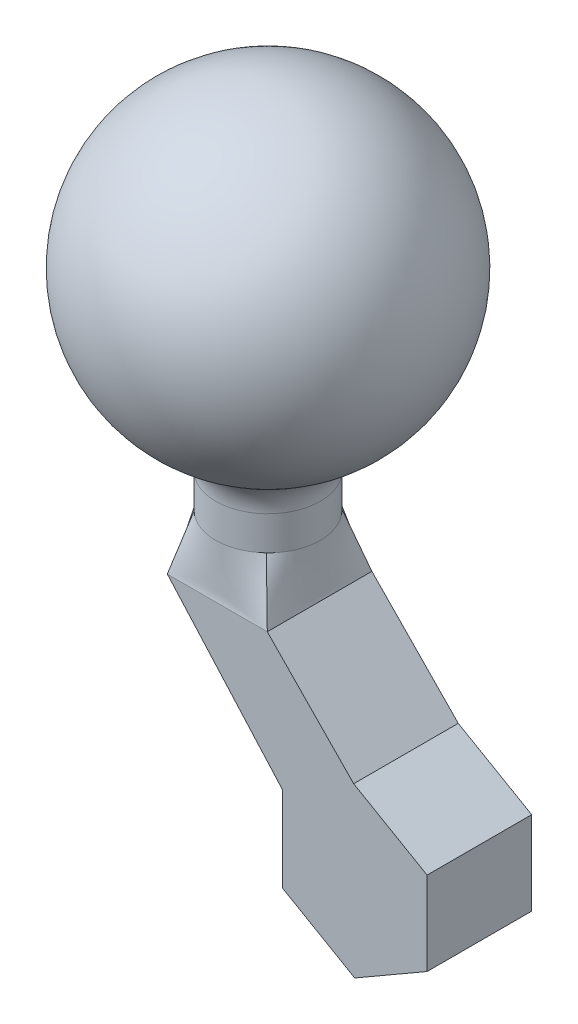
ISO-10303-21;
HEADER;
FILE_DESCRIPTION(('STEP AP214'),'2;1');
FILE_NAME('part.step','',(''),(''),'','','');
FILE_SCHEMA(('AUTOMOTIVE_DESIGN { 1 0 10303 214 1 1 1 1 }'));
ENDSEC;
DATA;
#1=APPLICATION_CONTEXT('core data for automotive mechanical design processes');
#2=APPLICATION_PROTOCOL_DEFINITION('international standard','automotive_design',2000,#1);
#3=PRODUCT_CONTEXT('',#1,'mechanical');
#4=PRODUCT('Part','Part','',(#3));
#5=PRODUCT_RELATED_PRODUCT_CATEGORY('part','',(#4));
#6=PRODUCT_DEFINITION_FORMATION('','',#4);
#7=PRODUCT_DEFINITION_CONTEXT('part definition',#1,'design');
#8=PRODUCT_DEFINITION('design','',#6,#7);
#9=PRODUCT_DEFINITION_SHAPE('','',#8);
#10=(LENGTH_UNIT() NAMED_UNIT(*) SI_UNIT(.MILLI.,.METRE.));
#11=(NAMED_UNIT(*) PLANE_ANGLE_UNIT() SI_UNIT($,.RADIAN.));
#12=(NAMED_UNIT(*) SI_UNIT($,.STERADIAN.) SOLID_ANGLE_UNIT());
#13=UNCERTAINTY_MEASURE_WITH_UNIT(LENGTH_MEASURE(1.E-05),#10,'distance_accuracy_value','');
#14=(GEOMETRIC_REPRESENTATION_CONTEXT(3) GLOBAL_UNCERTAINTY_ASSIGNED_CONTEXT((#13)) GLOBAL_UNIT_ASSIGNED_CONTEXT((#10,
#11,#12)) REPRESENTATION_CONTEXT('',''));
#15=CARTESIAN_POINT('',(0.,0.,0.));
#16=DIRECTION('',(0.,0.,1.));
#17=DIRECTION('',(1.,0.,0.));
#18=AXIS2_PLACEMENT_3D('',#15,#16,#17);
#19=CARTESIAN_POINT('',(0.,0.,0.));
#20=DIRECTION('',(0.,1.,0.));
#21=DIRECTION('',(-1.,0.,0.));
#22=AXIS2_PLACEMENT_3D('',#19,#20,#21);
#23=SPHERICAL_SURFACE('',#22,18.);
#24=CARTESIAN_POINT('',(0.,-15.8079207730885,0.));
#25=DIRECTION('',(0.,1.,0.));
#26=DIRECTION('',(0.,0.,1.));
#27=AXIS2_PLACEMENT_3D('',#24,#25,#26);
#28=CIRCLE('',#27,8.60869565217391);
#29=CARTESIAN_POINT('',(0.,-15.8079207730885,8.60869565217391));
#30=VERTEX_POINT('',#29);
#31=EDGE_CURVE('E71',#30,#30,#28,.T.);
#32=ORIENTED_EDGE('',*,*,#31,.T.);
#33=EDGE_LOOP('',(#32));
#34=FACE_BOUND('',#33,.T.);
#35=ADVANCED_FACE('F63',(#34),#23,.T.);
#36=CARTESIAN_POINT('',(0.,18.,0.));
#37=DIRECTION('',(0.,1.,0.));
#38=DIRECTION('',(0.,0.,1.));
#39=AXIS2_PLACEMENT_3D('',#36,#37,#38);
#40=CYLINDRICAL_SURFACE('',#39,6.);
#41=CARTESIAN_POINT('',(0.,-20.1990098767242,0.));
#42=DIRECTION('',(0.,1.,0.));
#43=DIRECTION('',(0.,0.,1.));
#44=AXIS2_PLACEMENT_3D('',#41,#42,#43);
#45=CIRCLE('',#44,6.);
#46=CARTESIAN_POINT('',(0.,-20.1990098767242,6.));
#47=VERTEX_POINT('',#46);
#48=EDGE_CURVE('E12',#47,#47,#45,.F.);
#49=ORIENTED_EDGE('',*,*,#48,.T.);
#50=EDGE_LOOP('',(#49));
#51=FACE_BOUND('',#50,.T.);
#52=CARTESIAN_POINT('',(4.14571833013754,-24.08,-4.33739778290643));
#53=CARTESIAN_POINT('',(4.40701026801478,-24.08,-4.08765292882736));
#54=CARTESIAN_POINT('',(4.65592378793548,-24.08,-3.80429383977832));
#55=CARTESIAN_POINT('',(5.10675760325183,-24.08,-3.17353189996074));
#56=CARTESIAN_POINT('',(5.30852063268487,-24.08,-2.82608401074052));
#57=CARTESIAN_POINT('',(5.64280491949333,-24.08,-2.07987855028752));
#58=CARTESIAN_POINT('',(5.77514435532255,-24.08,-1.68118045171521));
#59=CARTESIAN_POINT('',(5.95380439136581,-24.08,-0.854911285102975));
#60=CARTESIAN_POINT('',(6.,-24.08,-0.42751017146044));
#61=CARTESIAN_POINT('',(6.,-24.08,0.42751017146044));
#62=CARTESIAN_POINT('',(5.95380439136581,-24.08,0.854911285102975));
#63=CARTESIAN_POINT('',(5.77514435532255,-24.08,1.68118045171521));
#64=CARTESIAN_POINT('',(5.64280491949333,-24.08,2.07987855028752));
#65=CARTESIAN_POINT('',(5.30852063268487,-24.08,2.82608401074052));
#66=CARTESIAN_POINT('',(5.10675760325182,-24.08,3.17353189996074));
#67=CARTESIAN_POINT('',(4.65592378793549,-24.08,3.80429383977832));
#68=CARTESIAN_POINT('',(4.40701026801478,-24.08,4.08765292882735));
#69=CARTESIAN_POINT('',(4.14571833013754,-24.08,4.33739778290643));
#70=B_SPLINE_CURVE_WITH_KNOTS('',3,(#52,#53,#54,#55,#56,#57,#58,#59,#60,#61,#62,#63,#64,#65,#66,
#67,#68,#69),.UNSPECIFIED.,.F.,.F.,(4,2,2,2,2,2,2,2,4),(0.,0.125,0.25,0.375,0.5,0.625,0.75,
0.875,1.),.UNSPECIFIED.);
#71=CARTESIAN_POINT('',(4.14574127214119,-24.08,4.33742170811708));
#72=VERTEX_POINT('',#71);
#73=CARTESIAN_POINT('',(4.1457314055669,-24.08,-4.33741142811178));
#74=VERTEX_POINT('',#73);
#75=EDGE_CURVE('E235',#72,#74,#70,.F.);
#76=ORIENTED_EDGE('',*,*,#75,.T.);
#77=CARTESIAN_POINT('',(0.,-24.08,0.));
#78=DIRECTION('',(0.,1.,0.));
#79=DIRECTION('',(0.,0.,1.));
#80=AXIS2_PLACEMENT_3D('',#77,#78,#79);
#81=CIRCLE('',#80,6.);
#82=CARTESIAN_POINT('',(-4.14574127213373,-24.08,-4.33742170810931));
#83=VERTEX_POINT('',#82);
#84=EDGE_CURVE('E244',#74,#83,#81,.T.);
#85=ORIENTED_EDGE('',*,*,#84,.T.);
#86=CARTESIAN_POINT('',(-4.14573140556426,-24.08,4.33741142810902));
#87=VERTEX_POINT('',#86);
#88=EDGE_CURVE('E78',#83,#87,#81,.T.);
#89=ORIENTED_EDGE('',*,*,#88,.T.);
#90=EDGE_CURVE('E87',#87,#72,#81,.T.);
#91=ORIENTED_EDGE('',*,*,#90,.T.);
#92=EDGE_LOOP('',(#76,#85,#89,#91));
#93=FACE_BOUND('',#92,.T.);
#94=ADVANCED_FACE('F255',(#51,#93),#40,.T.);
#95=CARTESIAN_POINT('',(-5.55391904442774,-30.2,6.));
#96=CARTESIAN_POINT('',(-4.14571833013754,-24.08,4.33739778290643));
#97=CARTESIAN_POINT('',(-4.59811131416244,-30.2,6.));
#98=CARTESIAN_POINT('',(-3.6462286219794,-24.08,4.81481390715194));
#99=CARTESIAN_POINT('',(-3.64230358389714,-30.2,6.));
#100=CARTESIAN_POINT('',(-3.0247003274216,-24.08,5.23886904541464));
#101=CARTESIAN_POINT('',(-2.20859198849919,-30.2,6.));
#102=CARTESIAN_POINT('',(-1.95749985474671,-24.08,5.68478975469574));
#103=CARTESIAN_POINT('',(-1.73068812336654,-30.2,6.));
#104=CARTESIAN_POINT('',(-1.58029554790363,-24.08,5.80175097549326));
#105=CARTESIAN_POINT('',(-0.774880393101239,-30.2,6.));
#106=CARTESIAN_POINT('',(-0.802002169216812,-24.08,5.95939937585429));
#107=CARTESIAN_POINT('',(-0.296976527968589,-30.2,6.));
#108=CARTESIAN_POINT('',(-0.401040805162086,-24.08,6.));
#109=CARTESIAN_POINT('',(0.658831202296711,-30.2,6.));
#110=CARTESIAN_POINT('',(0.401040805162083,-24.08,6.));
#111=CARTESIAN_POINT('',(1.13673506742936,-30.2,6.));
#112=CARTESIAN_POINT('',(0.802002169216809,-24.08,5.95939937585429));
#113=CARTESIAN_POINT('',(2.09254279769466,-30.2,6.));
#114=CARTESIAN_POINT('',(1.58029554790363,-24.08,5.80175097549326));
#115=CARTESIAN_POINT('',(2.57044666282731,-30.2,6.));
#116=CARTESIAN_POINT('',(1.9574998547467,-24.08,5.68478975469574));
#117=CARTESIAN_POINT('',(4.00415825822526,-30.2,6.));
#118=CARTESIAN_POINT('',(3.0247003274216,-24.08,5.23886904541465));
#119=CARTESIAN_POINT('',(4.95996598849056,-30.2,6.));
#120=CARTESIAN_POINT('',(3.6462286219794,-24.08,4.81481390715194));
#121=CARTESIAN_POINT('',(5.91577371875587,-30.2,6.));
#122=CARTESIAN_POINT('',(4.14571833013754,-24.08,4.33739778290643));
#123=B_SPLINE_SURFACE_WITH_KNOTS('',3,1,((#95,#96),(#97,#98),(#99,#100),(#101,#102),(#103,#104),
(#105,#106),(#107,#108),(#109,#110),(#111,#112),(#113,#114),(#115,#116),(#117,#118),(#119,#120),
(#121,#122)),.UNSPECIFIED.,.F.,.F.,.F.,(4,2,2,2,2,2,4),(2,2),(0.,0.25,0.375,0.5,0.625,0.75,1.),
(0.,1.),.UNSPECIFIED.);
#124=DIRECTION('',(-1.,0.,0.));
#125=VECTOR('',#124,1.);
#126=CARTESIAN_POINT('',(-5.55391904442774,-30.2,6.));
#127=LINE('',#126,#125);
#128=CARTESIAN_POINT('',(5.91577371875587,-30.2,6.));
#129=VERTEX_POINT('',#128);
#130=CARTESIAN_POINT('',(-5.55391904442774,-30.2,6.));
#131=VERTEX_POINT('',#130);
#132=EDGE_CURVE('E144',#129,#131,#127,.T.);
#133=DIRECTION('',(-0.268833619175831,0.929497325301414,-0.252513776769391));
#134=VECTOR('',#133,1.);
#135=CARTESIAN_POINT('',(5.0307460244467,-27.14,5.16869889145321));
#136=LINE('',#135,#134);
#137=EDGE_CURVE('E147',#129,#72,#136,.T.);
#138=DIRECTION('',(-0.216770267725418,-0.942077379323195,0.255931362669354));
#139=VECTOR('',#138,1.);
#140=CARTESIAN_POINT('',(-4.84981868728264,-27.14,5.16869889145321));
#141=LINE('',#140,#139);
#142=EDGE_CURVE('E140',#87,#131,#141,.T.);
#143=ORIENTED_EDGE('',*,*,#132,.F.);
#144=ORIENTED_EDGE('',*,*,#137,.T.);
#145=ORIENTED_EDGE('',*,*,#90,.F.);
#146=ORIENTED_EDGE('',*,*,#142,.T.);
#147=EDGE_LOOP('',(#143,#144,#145,#146));
#148=FACE_BOUND('',#147,.T.);
#149=ADVANCED_FACE('F142',(#148),#123,.T.);
#150=CARTESIAN_POINT('',(5.91577371875587,-30.2,6.));
#151=CARTESIAN_POINT('',(4.14571833013754,-24.08,4.33739778290643));
#152=CARTESIAN_POINT('',(5.91577371875587,-30.2,5.5));
#153=CARTESIAN_POINT('',(4.40701026801478,-24.08,4.08765292882735));
#154=CARTESIAN_POINT('',(5.91577371875587,-30.2,5.));
#155=CARTESIAN_POINT('',(4.65592378793549,-24.08,3.80429383977832));
#156=CARTESIAN_POINT('',(5.91577371875587,-30.2,4.));
#157=CARTESIAN_POINT('',(5.10675760325182,-24.08,3.17353189996074));
#158=CARTESIAN_POINT('',(5.91577371875587,-30.2,3.5));
#159=CARTESIAN_POINT('',(5.30852063268487,-24.08,2.82608401074052));
#160=CARTESIAN_POINT('',(5.91577371875587,-30.2,2.5));
#161=CARTESIAN_POINT('',(5.64280491949333,-24.08,2.07987855028752));
#162=CARTESIAN_POINT('',(5.91577371875587,-30.2,2.));
#163=CARTESIAN_POINT('',(5.77514435532255,-24.08,1.68118045171521));
#164=CARTESIAN_POINT('',(5.91577371875587,-30.2,0.999999999999999));
#165=CARTESIAN_POINT('',(5.95380439136581,-24.08,0.854911285102975));
#166=CARTESIAN_POINT('',(5.91577371875587,-30.2,0.499999999999999));
#167=CARTESIAN_POINT('',(6.,-24.08,0.42751017146044));
#168=CARTESIAN_POINT('',(5.91577371875587,-30.2,-0.500000000000001));
#169=CARTESIAN_POINT('',(6.,-24.08,-0.42751017146044));
#170=CARTESIAN_POINT('',(5.91577371875587,-30.2,-1.));
#171=CARTESIAN_POINT('',(5.95380439136581,-24.08,-0.854911285102975));
#172=CARTESIAN_POINT('',(5.91577371875587,-30.2,-2.));
#173=CARTESIAN_POINT('',(5.77514435532255,-24.08,-1.68118045171521));
#174=CARTESIAN_POINT('',(5.91577371875587,-30.2,-2.5));
#175=CARTESIAN_POINT('',(5.64280491949333,-24.08,-2.07987855028752));
#176=CARTESIAN_POINT('',(5.91577371875587,-30.2,-3.5));
#177=CARTESIAN_POINT('',(5.30852063268487,-24.08,-2.82608401074052));
#178=CARTESIAN_POINT('',(5.91577371875587,-30.2,-4.));
#179=CARTESIAN_POINT('',(5.10675760325183,-24.08,-3.17353189996074));
#180=CARTESIAN_POINT('',(5.91577371875587,-30.2,-5.));
#181=CARTESIAN_POINT('',(4.65592378793548,-24.08,-3.80429383977832));
#182=CARTESIAN_POINT('',(5.91577371875587,-30.2,-5.5));
#183=CARTESIAN_POINT('',(4.40701026801478,-24.08,-4.08765292882736));
#184=CARTESIAN_POINT('',(5.91577371875587,-30.2,-6.));
#185=CARTESIAN_POINT('',(4.14571833013754,-24.08,-4.33739778290643));
#186=B_SPLINE_SURFACE_WITH_KNOTS('',3,1,((#150,#151),(#152,#153),(#154,#155),(#156,#157),(#158,
#159),(#160,#161),(#162,#163),(#164,#165),(#166,#167),(#168,#169),(#170,#171),(#172,#173),(#174,
#175),(#176,#177),(#178,#179),(#180,#181),(#182,#183),(#184,#185)),.UNSPECIFIED.,.F.,.F.,.F.,(4,
2,2,2,2,2,2,2,4),(2,2),(0.,0.125,0.25,0.375,0.5,0.625,0.75,0.875,1.),(0.,1.),.UNSPECIFIED.);
#187=DIRECTION('',(0.,0.,1.));
#188=VECTOR('',#187,1.);
#189=CARTESIAN_POINT('',(5.91577371875587,-30.2,-6.));
#190=LINE('',#189,#188);
#191=CARTESIAN_POINT('',(5.91577371875587,-30.2,-6.));
#192=VERTEX_POINT('',#191);
#193=EDGE_CURVE('E180',#192,#129,#190,.T.);
#194=DIRECTION('',(-0.268833619175832,0.929497325301414,0.252513776769391));
#195=VECTOR('',#194,1.);
#196=CARTESIAN_POINT('',(5.0307460244467,-27.14,-5.16869889145321));
#197=LINE('',#196,#195);
#198=EDGE_CURVE('E465',#192,#74,#197,.T.);
#199=ORIENTED_EDGE('',*,*,#193,.F.);
#200=ORIENTED_EDGE('',*,*,#198,.T.);
#201=ORIENTED_EDGE('',*,*,#75,.F.);
#202=ORIENTED_EDGE('',*,*,#137,.F.);
#203=EDGE_LOOP('',(#199,#200,#201,#202));
#204=FACE_BOUND('',#203,.T.);
#205=ADVANCED_FACE('F285',(#204),#186,.T.);
#206=CARTESIAN_POINT('',(-5.55391904442774,-30.2,-6.));
#207=CARTESIAN_POINT('',(-4.14571833013754,-24.08,-4.33739778290643));
#208=CARTESIAN_POINT('',(-5.55391904442774,-30.2,-5.5));
#209=CARTESIAN_POINT('',(-4.40701026801478,-24.08,-4.08765292882736));
#210=CARTESIAN_POINT('',(-5.55391904442774,-30.2,-5.));
#211=CARTESIAN_POINT('',(-4.65592378793548,-24.08,-3.80429383977832));
#212=CARTESIAN_POINT('',(-5.55391904442774,-30.2,-4.));
#213=CARTESIAN_POINT('',(-5.10675760325182,-24.08,-3.17353189996074));
#214=CARTESIAN_POINT('',(-5.55391904442774,-30.2,-3.5));
#215=CARTESIAN_POINT('',(-5.30852063268487,-24.08,-2.82608401074052));
#216=CARTESIAN_POINT('',(-5.55391904442774,-30.2,-2.50000000000001));
#217=CARTESIAN_POINT('',(-5.64280491949333,-24.08,-2.07987855028752));
#218=CARTESIAN_POINT('',(-5.55391904442774,-30.2,-2.00000000000001));
#219=CARTESIAN_POINT('',(-5.77514435532255,-24.08,-1.68118045171521));
#220=CARTESIAN_POINT('',(-5.55391904442774,-30.2,-1.00000000000001));
#221=CARTESIAN_POINT('',(-5.95380439136581,-24.08,-0.854911285102977));
#222=CARTESIAN_POINT('',(-5.55391904442774,-30.2,-0.500000000000007));
#223=CARTESIAN_POINT('',(-6.,-24.08,-0.427510171460441));
#224=CARTESIAN_POINT('',(-5.55391904442774,-30.2,0.499999999999994));
#225=CARTESIAN_POINT('',(-6.,-24.08,0.427510171460439));
#226=CARTESIAN_POINT('',(-5.55391904442774,-30.2,0.999999999999994));
#227=CARTESIAN_POINT('',(-5.95380439136581,-24.08,0.854911285102974));
#228=CARTESIAN_POINT('',(-5.55391904442774,-30.2,1.99999999999999));
#229=CARTESIAN_POINT('',(-5.77514435532255,-24.08,1.68118045171521));
#230=CARTESIAN_POINT('',(-5.55391904442774,-30.2,2.5));
#231=CARTESIAN_POINT('',(-5.64280491949333,-24.08,2.07987855028752));
#232=CARTESIAN_POINT('',(-5.55391904442774,-30.2,3.5));
#233=CARTESIAN_POINT('',(-5.30852063268487,-24.08,2.82608401074052));
#234=CARTESIAN_POINT('',(-5.55391904442774,-30.2,4.));
#235=CARTESIAN_POINT('',(-5.10675760325183,-24.08,3.17353189996074));
#236=CARTESIAN_POINT('',(-5.55391904442774,-30.2,5.));
#237=CARTESIAN_POINT('',(-4.65592378793549,-24.08,3.80429383977832));
#238=CARTESIAN_POINT('',(-5.55391904442774,-30.2,5.5));
#239=CARTESIAN_POINT('',(-4.40701026801478,-24.08,4.08765292882736));
#240=CARTESIAN_POINT('',(-5.55391904442774,-30.2,6.));
#241=CARTESIAN_POINT('',(-4.14571833013754,-24.08,4.33739778290643));
#242=B_SPLINE_SURFACE_WITH_KNOTS('',3,1,((#206,#207),(#208,#209),(#210,#211),(#212,#213),(#214,
#215),(#216,#217),(#218,#219),(#220,#221),(#222,#223),(#224,#225),(#226,#227),(#228,#229),(#230,
#231),(#232,#233),(#234,#235),(#236,#237),(#238,#239),(#240,#241)),.UNSPECIFIED.,.F.,.F.,.F.,(4,
2,2,2,2,2,2,2,4),(2,2),(0.,0.125,0.25,0.375,0.5,0.625,0.75,0.875,1.),(0.,1.),.UNSPECIFIED.);
#243=DIRECTION('',(0.,0.,1.));
#244=VECTOR('',#243,1.);
#245=CARTESIAN_POINT('',(-5.55391904442774,-30.2,-6.));
#246=LINE('',#245,#244);
#247=CARTESIAN_POINT('',(-5.55391904442774,-30.2,-6.));
#248=VERTEX_POINT('',#247);
#249=EDGE_CURVE('E151',#248,#131,#246,.T.);
#250=DIRECTION('',(0.216770267725418,0.942077379323195,0.255931362669353));
#251=VECTOR('',#250,1.);
#252=CARTESIAN_POINT('',(-4.84981868728264,-27.14,-5.16869889145321));
#253=LINE('',#252,#251);
#254=EDGE_CURVE('E155',#248,#83,#253,.T.);
#255=ORIENTED_EDGE('',*,*,#249,.T.);
#256=ORIENTED_EDGE('',*,*,#142,.F.);
#257=ORIENTED_EDGE('',*,*,#88,.F.);
#258=ORIENTED_EDGE('',*,*,#254,.F.);
#259=EDGE_LOOP('',(#255,#256,#257,#258));
#260=FACE_BOUND('',#259,.T.);
#261=ADVANCED_FACE('F154',(#260),#242,.T.);
#262=CARTESIAN_POINT('',(5.91577371875587,-30.2,-6.));
#263=CARTESIAN_POINT('',(4.14571833013754,-24.08,-4.33739778290643));
#264=CARTESIAN_POINT('',(4.95996598849057,-30.2,-6.));
#265=CARTESIAN_POINT('',(3.6462286219794,-24.08,-4.81481390715194));
#266=CARTESIAN_POINT('',(4.00415825822527,-30.2,-6.));
#267=CARTESIAN_POINT('',(3.02470032742161,-24.08,-5.23886904541464));
#268=CARTESIAN_POINT('',(2.57044666282732,-30.2,-6.));
#269=CARTESIAN_POINT('',(1.95749985474671,-24.08,-5.68478975469574));
#270=CARTESIAN_POINT('',(2.09254279769466,-30.2,-6.));
#271=CARTESIAN_POINT('',(1.58029554790363,-24.08,-5.80175097549326));
#272=CARTESIAN_POINT('',(1.13673506742936,-30.2,-6.));
#273=CARTESIAN_POINT('',(0.802002169216811,-24.08,-5.95939937585429));
#274=CARTESIAN_POINT('',(0.658831202296713,-30.2,-6.));
#275=CARTESIAN_POINT('',(0.401040805162085,-24.08,-6.));
#276=CARTESIAN_POINT('',(-0.296976527968588,-30.2,-6.));
#277=CARTESIAN_POINT('',(-0.401040805162082,-24.08,-6.));
#278=CARTESIAN_POINT('',(-0.774880393101237,-30.2,-6.));
#279=CARTESIAN_POINT('',(-0.802002169216809,-24.08,-5.95939937585429));
#280=CARTESIAN_POINT('',(-1.73068812336654,-30.2,-6.));
#281=CARTESIAN_POINT('',(-1.58029554790363,-24.08,-5.80175097549326));
#282=CARTESIAN_POINT('',(-2.20859198849919,-30.2,-6.));
#283=CARTESIAN_POINT('',(-1.9574998547467,-24.08,-5.68478975469574));
#284=CARTESIAN_POINT('',(-3.64230358389714,-30.2,-6.));
#285=CARTESIAN_POINT('',(-3.0247003274216,-24.08,-5.23886904541464));
#286=CARTESIAN_POINT('',(-4.59811131416244,-30.2,-6.));
#287=CARTESIAN_POINT('',(-3.6462286219794,-24.08,-4.81481390715194));
#288=CARTESIAN_POINT('',(-5.55391904442774,-30.2,-6.));
#289=CARTESIAN_POINT('',(-4.14571833013754,-24.08,-4.33739778290643));
#290=B_SPLINE_SURFACE_WITH_KNOTS('',3,1,((#262,#263),(#264,#265),(#266,#267),(#268,#269),(#270,
#271),(#272,#273),(#274,#275),(#276,#277),(#278,#279),(#280,#281),(#282,#283),(#284,#285),(#286,
#287),(#288,#289)),.UNSPECIFIED.,.F.,.F.,.F.,(4,2,2,2,2,2,4),(2,2),(0.,0.25,0.375,0.5,0.625,
0.75,1.),(0.,1.),.UNSPECIFIED.);
#291=DIRECTION('',(-1.,0.,0.));
#292=VECTOR('',#291,1.);
#293=CARTESIAN_POINT('',(-5.55391904442774,-30.2,-6.));
#294=LINE('',#293,#292);
#295=EDGE_CURVE('E148',#192,#248,#294,.T.);
#296=ORIENTED_EDGE('',*,*,#295,.T.);
#297=ORIENTED_EDGE('',*,*,#254,.T.);
#298=ORIENTED_EDGE('',*,*,#84,.F.);
#299=ORIENTED_EDGE('',*,*,#198,.F.);
#300=EDGE_LOOP('',(#296,#297,#298,#299));
#301=FACE_BOUND('',#300,.T.);
#302=ADVANCED_FACE('F265',(#301),#290,.T.);
#303=CARTESIAN_POINT('',(5.91577371875587,-30.2,-6.));
#304=DIRECTION('',(0.715387628117391,0.698727802178053,0.));
#305=DIRECTION('',(-0.698727802178053,0.715387628117392,0.));
#306=AXIS2_PLACEMENT_3D('',#303,#304,#305);
#307=PLANE('',#306);
#308=ORIENTED_EDGE('',*,*,#193,.T.);
#309=DIRECTION('',(-0.698727802178053,0.715387628117391,0.));
#310=VECTOR('',#309,1.);
#311=CARTESIAN_POINT('',(5.91577371875587,-30.2,6.));
#312=LINE('',#311,#310);
#313=CARTESIAN_POINT('',(15.8240162033495,-40.344485546117,6.));
#314=VERTEX_POINT('',#313);
#315=EDGE_CURVE('E179',#314,#129,#312,.T.);
#316=ORIENTED_EDGE('',*,*,#315,.F.);
#317=DIRECTION('',(0.,0.,1.));
#318=VECTOR('',#317,1.);
#319=CARTESIAN_POINT('',(15.8240162033495,-40.344485546117,-6.));
#320=LINE('',#319,#318);
#321=CARTESIAN_POINT('',(15.8240162033495,-40.344485546117,-6.));
#322=VERTEX_POINT('',#321);
#323=EDGE_CURVE('E161',#322,#314,#320,.T.);
#324=ORIENTED_EDGE('',*,*,#323,.F.);
#325=DIRECTION('',(-0.698727802178053,0.715387628117391,0.));
#326=VECTOR('',#325,1.);
#327=CARTESIAN_POINT('',(5.91577371875587,-30.2,-6.));
#328=LINE('',#327,#326);
#329=EDGE_CURVE('E502',#322,#192,#328,.T.);
#330=ORIENTED_EDGE('',*,*,#329,.T.);
#331=EDGE_LOOP('',(#308,#316,#324,#330));
#332=FACE_BOUND('',#331,.T.);
#333=ADVANCED_FACE('F203',(#332),#307,.T.);
#334=CARTESIAN_POINT('',(24.2478578106904,-45.2079927657261,-6.));
#335=DIRECTION('',(0.5,0.866025403784439,0.));
#336=DIRECTION('',(-0.866025403784439,0.5,0.));
#337=AXIS2_PLACEMENT_3D('',#334,#335,#336);
#338=PLANE('',#337);
#339=ORIENTED_EDGE('',*,*,#323,.T.);
#340=DIRECTION('',(-0.866025403784438,0.5,0.));
#341=VECTOR('',#340,1.);
#342=CARTESIAN_POINT('',(24.2478578106904,-45.2079927657261,6.));
#343=LINE('',#342,#341);
#344=CARTESIAN_POINT('',(24.2478578106904,-45.2079927657261,6.));
#345=VERTEX_POINT('',#344);
#346=EDGE_CURVE('E526',#345,#314,#343,.T.);
#347=ORIENTED_EDGE('',*,*,#346,.F.);
#348=DIRECTION('',(0.,0.,1.));
#349=VECTOR('',#348,1.);
#350=CARTESIAN_POINT('',(24.2478578106904,-45.2079927657261,-6.));
#351=LINE('',#350,#349);
#352=CARTESIAN_POINT('',(24.2478578106904,-45.2079927657261,-6.));
#353=VERTEX_POINT('',#352);
#354=EDGE_CURVE('E508',#353,#345,#351,.T.);
#355=ORIENTED_EDGE('',*,*,#354,.F.);
#356=DIRECTION('',(-0.866025403784438,0.5,0.));
#357=VECTOR('',#356,1.);
#358=CARTESIAN_POINT('',(24.2478578106904,-45.2079927657261,-6.));
#359=LINE('',#358,#357);
#360=EDGE_CURVE('E511',#353,#322,#359,.T.);
#361=ORIENTED_EDGE('',*,*,#360,.T.);
#362=EDGE_LOOP('',(#339,#347,#355,#361));
#363=FACE_BOUND('',#362,.T.);
#364=ADVANCED_FACE('F310',(#363),#338,.T.);
#365=CARTESIAN_POINT('',(24.2478578106904,-54.7920072342739,-6.));
#366=DIRECTION('',(1.,0.,0.));
#367=DIRECTION('',(0.,0.,-1.));
#368=AXIS2_PLACEMENT_3D('',#365,#366,#367);
#369=PLANE('',#368);
#370=ORIENTED_EDGE('',*,*,#354,.T.);
#371=DIRECTION('',(0.,1.,0.));
#372=VECTOR('',#371,1.);
#373=CARTESIAN_POINT('',(24.2478578106904,-54.7920072342739,6.));
#374=LINE('',#373,#372);
#375=CARTESIAN_POINT('',(24.2478578106904,-54.7920072342739,6.));
#376=VERTEX_POINT('',#375);
#377=EDGE_CURVE('E528',#376,#345,#374,.T.);
#378=ORIENTED_EDGE('',*,*,#377,.F.);
#379=DIRECTION('',(0.,0.,1.));
#380=VECTOR('',#379,1.);
#381=CARTESIAN_POINT('',(24.2478578106904,-54.7920072342739,-6.));
#382=LINE('',#381,#380);
#383=CARTESIAN_POINT('',(24.2478578106904,-54.7920072342739,-6.));
#384=VERTEX_POINT('',#383);
#385=EDGE_CURVE('E506',#384,#376,#382,.T.);
#386=ORIENTED_EDGE('',*,*,#385,.F.);
#387=DIRECTION('',(0.,1.,0.));
#388=VECTOR('',#387,1.);
#389=CARTESIAN_POINT('',(24.2478578106904,-54.7920072342739,-6.));
#390=LINE('',#389,#388);
#391=EDGE_CURVE('E514',#384,#353,#390,.T.);
#392=ORIENTED_EDGE('',*,*,#391,.T.);
#393=EDGE_LOOP('',(#370,#378,#386,#392));
#394=FACE_BOUND('',#393,.T.);
#395=ADVANCED_FACE('F317',(#394),#369,.T.);
#396=CARTESIAN_POINT('',(15.9478578106904,-59.5840144685478,-6.));
#397=DIRECTION('',(0.5,-0.866025403784439,0.));
#398=DIRECTION('',(0.866025403784439,0.5,0.));
#399=AXIS2_PLACEMENT_3D('',#396,#397,#398);
#400=PLANE('',#399);
#401=ORIENTED_EDGE('',*,*,#385,.T.);
#402=DIRECTION('',(0.866025403784439,0.5,0.));
#403=VECTOR('',#402,1.);
#404=CARTESIAN_POINT('',(15.9478578106904,-59.5840144685478,6.));
#405=LINE('',#404,#403);
#406=CARTESIAN_POINT('',(15.9478578106904,-59.5840144685478,6.));
#407=VERTEX_POINT('',#406);
#408=EDGE_CURVE('E531',#407,#376,#405,.T.);
#409=ORIENTED_EDGE('',*,*,#408,.F.);
#410=DIRECTION('',(0.,0.,1.));
#411=VECTOR('',#410,1.);
#412=CARTESIAN_POINT('',(15.9478578106904,-59.5840144685478,-6.));
#413=LINE('',#412,#411);
#414=CARTESIAN_POINT('',(15.9478578106904,-59.5840144685478,-6.));
#415=VERTEX_POINT('',#414);
#416=EDGE_CURVE('E504',#415,#407,#413,.T.);
#417=ORIENTED_EDGE('',*,*,#416,.F.);
#418=DIRECTION('',(0.866025403784439,0.5,0.));
#419=VECTOR('',#418,1.);
#420=CARTESIAN_POINT('',(15.9478578106904,-59.5840144685478,-6.));
#421=LINE('',#420,#419);
#422=EDGE_CURVE('E517',#415,#384,#421,.T.);
#423=ORIENTED_EDGE('',*,*,#422,.T.);
#424=EDGE_LOOP('',(#401,#409,#417,#423));
#425=FACE_BOUND('',#424,.T.);
#426=ADVANCED_FACE('F324',(#425),#400,.T.);
#427=CARTESIAN_POINT('',(7.64785781069043,-54.7920072342739,-6.));
#428=DIRECTION('',(-0.5,-0.866025403784439,0.));
#429=DIRECTION('',(0.866025403784439,-0.5,0.));
#430=AXIS2_PLACEMENT_3D('',#427,#428,#429);
#431=PLANE('',#430);
#432=ORIENTED_EDGE('',*,*,#416,.T.);
#433=DIRECTION('',(0.866025403784439,-0.5,0.));
#434=VECTOR('',#433,1.);
#435=CARTESIAN_POINT('',(7.64785781069043,-54.7920072342739,6.));
#436=LINE('',#435,#434);
#437=CARTESIAN_POINT('',(7.64785781069043,-54.7920072342739,6.));
#438=VERTEX_POINT('',#437);
#439=EDGE_CURVE('E534',#438,#407,#436,.T.);
#440=ORIENTED_EDGE('',*,*,#439,.F.);
#441=DIRECTION('',(0.,0.,1.));
#442=VECTOR('',#441,1.);
#443=CARTESIAN_POINT('',(7.64785781069043,-54.7920072342739,-6.));
#444=LINE('',#443,#442);
#445=CARTESIAN_POINT('',(7.64785781069043,-54.7920072342739,-6.));
#446=VERTEX_POINT('',#445);
#447=EDGE_CURVE('E501',#446,#438,#444,.T.);
#448=ORIENTED_EDGE('',*,*,#447,.F.);
#449=DIRECTION('',(0.866025403784439,-0.5,0.));
#450=VECTOR('',#449,1.);
#451=CARTESIAN_POINT('',(7.64785781069043,-54.7920072342739,-6.));
#452=LINE('',#451,#450);
#453=EDGE_CURVE('E520',#446,#415,#452,.T.);
#454=ORIENTED_EDGE('',*,*,#453,.T.);
#455=EDGE_LOOP('',(#432,#440,#448,#454));
#456=FACE_BOUND('',#455,.T.);
#457=ADVANCED_FACE('F332',(#456),#431,.T.);
#458=CARTESIAN_POINT('',(7.64785781069043,-45.0163462038361,-6.));
#459=DIRECTION('',(-1.,0.,0.));
#460=DIRECTION('',(0.,0.,1.));
#461=AXIS2_PLACEMENT_3D('',#458,#459,#460);
#462=PLANE('',#461);
#463=ORIENTED_EDGE('',*,*,#447,.T.);
#464=DIRECTION('',(0.,-1.,0.));
#465=VECTOR('',#464,1.);
#466=CARTESIAN_POINT('',(7.64785781069043,-45.0163462038361,6.));
#467=LINE('',#466,#465);
#468=CARTESIAN_POINT('',(7.64785781069043,-45.0163462038361,6.));
#469=VERTEX_POINT('',#468);
#470=EDGE_CURVE('E172',#469,#438,#467,.T.);
#471=ORIENTED_EDGE('',*,*,#470,.F.);
#472=DIRECTION('',(0.,0.,1.));
#473=VECTOR('',#472,1.);
#474=CARTESIAN_POINT('',(7.64785781069043,-45.0163462038361,-6.));
#475=LINE('',#474,#473);
#476=CARTESIAN_POINT('',(7.64785781069043,-45.0163462038361,-6.));
#477=VERTEX_POINT('',#476);
#478=EDGE_CURVE('E168',#477,#469,#475,.T.);
#479=ORIENTED_EDGE('',*,*,#478,.F.);
#480=DIRECTION('',(0.,-1.,0.));
#481=VECTOR('',#480,1.);
#482=CARTESIAN_POINT('',(7.64785781069043,-45.0163462038361,-6.));
#483=LINE('',#482,#481);
#484=EDGE_CURVE('E523',#477,#446,#483,.T.);
#485=ORIENTED_EDGE('',*,*,#484,.T.);
#486=EDGE_LOOP('',(#463,#471,#479,#485));
#487=FACE_BOUND('',#486,.T.);
#488=ADVANCED_FACE('F340',(#487),#462,.T.);
#489=CARTESIAN_POINT('',(7.64785781069043,-45.0163462038361,-6.));
#490=DIRECTION('',(-0.746615808227149,-0.665255465896614,0.));
#491=DIRECTION('',(0.665255465896614,-0.746615808227149,0.));
#492=AXIS2_PLACEMENT_3D('',#489,#490,#491);
#493=PLANE('',#492);
#494=ORIENTED_EDGE('',*,*,#478,.T.);
#495=DIRECTION('',(0.665255465896614,-0.746615808227149,0.));
#496=VECTOR('',#495,1.);
#497=CARTESIAN_POINT('',(7.64785781069043,-45.0163462038361,6.));
#498=LINE('',#497,#496);
#499=EDGE_CURVE('E166',#131,#469,#498,.T.);
#500=ORIENTED_EDGE('',*,*,#499,.F.);
#501=ORIENTED_EDGE('',*,*,#249,.F.);
#502=DIRECTION('',(0.665255465896614,-0.746615808227149,0.));
#503=VECTOR('',#502,1.);
#504=CARTESIAN_POINT('',(7.64785781069043,-45.0163462038361,-6.));
#505=LINE('',#504,#503);
#506=EDGE_CURVE('E220',#248,#477,#505,.T.);
#507=ORIENTED_EDGE('',*,*,#506,.T.);
#508=EDGE_LOOP('',(#494,#500,#501,#507));
#509=FACE_BOUND('',#508,.T.);
#510=ADVANCED_FACE('F167',(#509),#493,.T.);
#511=CARTESIAN_POINT('',(0.,0.,-6.));
#512=DIRECTION('',(0.,0.,1.));
#513=DIRECTION('',(1.,0.,0.));
#514=AXIS2_PLACEMENT_3D('',#511,#512,#513);
#515=PLANE('',#514);
#516=ORIENTED_EDGE('',*,*,#295,.F.);
#517=ORIENTED_EDGE('',*,*,#329,.F.);
#518=ORIENTED_EDGE('',*,*,#360,.F.);
#519=ORIENTED_EDGE('',*,*,#391,.F.);
#520=ORIENTED_EDGE('',*,*,#422,.F.);
#521=ORIENTED_EDGE('',*,*,#453,.F.);
#522=ORIENTED_EDGE('',*,*,#484,.F.);
#523=ORIENTED_EDGE('',*,*,#506,.F.);
#524=EDGE_LOOP('',(#516,#517,#518,#519,#520,#521,#522,#523));
#525=FACE_BOUND('',#524,.T.);
#526=ADVANCED_FACE('F198',(#525),#515,.F.);
#527=CARTESIAN_POINT('',(0.,0.,6.));
#528=DIRECTION('',(0.,0.,1.));
#529=DIRECTION('',(1.,0.,0.));
#530=AXIS2_PLACEMENT_3D('',#527,#528,#529);
#531=PLANE('',#530);
#532=ORIENTED_EDGE('',*,*,#132,.T.);
#533=ORIENTED_EDGE('',*,*,#499,.T.);
#534=ORIENTED_EDGE('',*,*,#470,.T.);
#535=ORIENTED_EDGE('',*,*,#439,.T.);
#536=ORIENTED_EDGE('',*,*,#408,.T.);
#537=ORIENTED_EDGE('',*,*,#377,.T.);
#538=ORIENTED_EDGE('',*,*,#346,.T.);
#539=ORIENTED_EDGE('',*,*,#315,.T.);
#540=EDGE_LOOP('',(#532,#533,#534,#535,#536,#537,#538,#539));
#541=FACE_BOUND('',#540,.T.);
#542=ADVANCED_FACE('F176',(#541),#531,.T.);
#543=CARTESIAN_POINT('',(0.,-20.1990098767242,0.));
#544=DIRECTION('',(0.,1.,0.));
#545=DIRECTION('',(0.,0.,1.));
#546=AXIS2_PLACEMENT_3D('',#543,#544,#545);
#547=TOROIDAL_SURFACE('',#546,11.,5.);
#548=ORIENTED_EDGE('',*,*,#48,.F.);
#549=EDGE_LOOP('',(#548));
#550=FACE_BOUND('',#549,.T.);
#551=ORIENTED_EDGE('',*,*,#31,.F.);
#552=EDGE_LOOP('',(#551));
#553=FACE_BOUND('',#552,.T.);
#554=ADVANCED_FACE('F65',(#550,#553),#547,.F.);
#555=CLOSED_SHELL('',(#35,#94,#149,#205,#261,#302,#333,#364,#395,#426,#457,#488,#510,#526,#542,#554));
#556=MANIFOLD_SOLID_BREP('B2',#555);
#557=ADVANCED_BREP_SHAPE_REPRESENTATION('',(#18,#556),#14);
#558=SHAPE_DEFINITION_REPRESENTATION(#9,#557);
ENDSEC;
END-ISO-10303-21;
